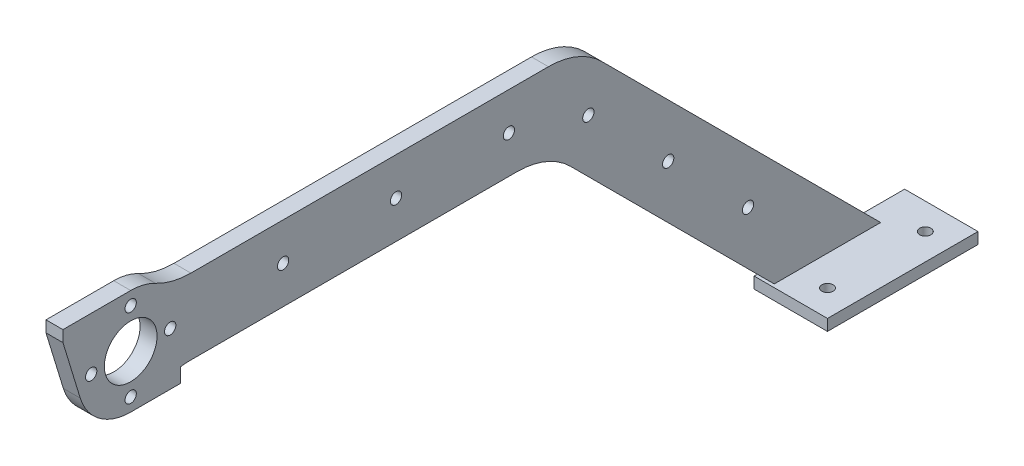
ISO-10303-21;
HEADER;
FILE_DESCRIPTION(('STEP AP214'),'2;1');
FILE_NAME('part.step','',(''),(''),'','','');
FILE_SCHEMA(('AUTOMOTIVE_DESIGN { 1 0 10303 214 1 1 1 1 }'));
ENDSEC;
DATA;
#1=APPLICATION_CONTEXT('core data for automotive mechanical design processes');
#2=APPLICATION_PROTOCOL_DEFINITION('international standard','automotive_design',2000,#1);
#3=PRODUCT_CONTEXT('',#1,'mechanical');
#4=PRODUCT('Part','Part','',(#3));
#5=PRODUCT_RELATED_PRODUCT_CATEGORY('part','',(#4));
#6=PRODUCT_DEFINITION_FORMATION('','',#4);
#7=PRODUCT_DEFINITION_CONTEXT('part definition',#1,'design');
#8=PRODUCT_DEFINITION('design','',#6,#7);
#9=PRODUCT_DEFINITION_SHAPE('','',#8);
#10=(LENGTH_UNIT() NAMED_UNIT(*) SI_UNIT(.MILLI.,.METRE.));
#11=(NAMED_UNIT(*) PLANE_ANGLE_UNIT() SI_UNIT($,.RADIAN.));
#12=(NAMED_UNIT(*) SI_UNIT($,.STERADIAN.) SOLID_ANGLE_UNIT());
#13=UNCERTAINTY_MEASURE_WITH_UNIT(LENGTH_MEASURE(1.E-05),#10,'distance_accuracy_value','');
#14=(GEOMETRIC_REPRESENTATION_CONTEXT(3) GLOBAL_UNCERTAINTY_ASSIGNED_CONTEXT((#13)) GLOBAL_UNIT_ASSIGNED_CONTEXT((#10,
#11,#12)) REPRESENTATION_CONTEXT('',''));
#15=CARTESIAN_POINT('',(0.,0.,0.));
#16=DIRECTION('',(0.,0.,1.));
#17=DIRECTION('',(1.,0.,0.));
#18=AXIS2_PLACEMENT_3D('',#15,#16,#17);
#19=CARTESIAN_POINT('',(2.25,-30.,-16.));
#20=DIRECTION('',(-1.,0.,0.));
#21=DIRECTION('',(0.,0.,1.));
#22=AXIS2_PLACEMENT_3D('',#19,#20,#21);
#23=CYLINDRICAL_SURFACE('',#22,20.);
#24=CARTESIAN_POINT('',(-2.25,-30.,-16.));
#25=DIRECTION('',(1.,0.,0.));
#26=DIRECTION('',(0.,0.,-1.));
#27=AXIS2_PLACEMENT_3D('',#24,#25,#26);
#28=CIRCLE('',#27,20.);
#29=CARTESIAN_POINT('',(-2.25,-10.,-16.));
#30=VERTEX_POINT('',#29);
#31=CARTESIAN_POINT('',(-2.25,-10.1935572336007,-13.2242433569657));
#32=VERTEX_POINT('',#31);
#33=EDGE_CURVE('E234',#30,#32,#28,.T.);
#34=ORIENTED_EDGE('',*,*,#33,.F.);
#35=DIRECTION('',(-1.,0.,0.));
#36=VECTOR('',#35,1.);
#37=CARTESIAN_POINT('',(2.25,-10.,-16.));
#38=LINE('',#37,#36);
#39=CARTESIAN_POINT('',(2.25,-10.,-16.));
#40=VERTEX_POINT('',#39);
#41=EDGE_CURVE('E11',#40,#30,#38,.T.);
#42=ORIENTED_EDGE('',*,*,#41,.F.);
#43=CARTESIAN_POINT('',(2.25,-30.,-16.));
#44=DIRECTION('',(1.,0.,0.));
#45=DIRECTION('',(0.,0.,-1.));
#46=AXIS2_PLACEMENT_3D('',#43,#44,#45);
#47=CIRCLE('',#46,20.);
#48=CARTESIAN_POINT('',(2.25,-10.1935572336007,-13.2242433569657));
#49=VERTEX_POINT('',#48);
#50=EDGE_CURVE('E322',#40,#49,#47,.T.);
#51=ORIENTED_EDGE('',*,*,#50,.T.);
#52=DIRECTION('',(-1.,0.,0.));
#53=VECTOR('',#52,1.);
#54=CARTESIAN_POINT('',(2.25,-10.1935572336007,-13.2242433569657));
#55=LINE('',#54,#53);
#56=EDGE_CURVE('E115',#49,#32,#55,.T.);
#57=ORIENTED_EDGE('',*,*,#56,.T.);
#58=EDGE_LOOP('',(#34,#42,#51,#57));
#59=FACE_BOUND('',#58,.T.);
#60=ADVANCED_FACE('F41',(#59),#23,.F.);
#61=CARTESIAN_POINT('',(2.25,-10.,0.));
#62=DIRECTION('',(0.,1.,0.));
#63=DIRECTION('',(0.,0.,1.));
#64=AXIS2_PLACEMENT_3D('',#61,#62,#63);
#65=PLANE('',#64);
#66=DIRECTION('',(0.,0.,-1.));
#67=VECTOR('',#66,1.);
#68=CARTESIAN_POINT('',(-2.25,-10.,0.));
#69=LINE('',#68,#67);
#70=CARTESIAN_POINT('',(-2.25,-10.,-102.736907966864));
#71=VERTEX_POINT('',#70);
#72=EDGE_CURVE('E238',#30,#71,#69,.T.);
#73=ORIENTED_EDGE('',*,*,#72,.T.);
#74=DIRECTION('',(-1.,0.,0.));
#75=VECTOR('',#74,1.);
#76=CARTESIAN_POINT('',(2.25,-10.,-102.736907966864));
#77=LINE('',#76,#75);
#78=CARTESIAN_POINT('',(2.25,-10.,-102.736907966864));
#79=VERTEX_POINT('',#78);
#80=EDGE_CURVE('E50',#79,#71,#77,.T.);
#81=ORIENTED_EDGE('',*,*,#80,.F.);
#82=DIRECTION('',(0.,0.,-1.));
#83=VECTOR('',#82,1.);
#84=CARTESIAN_POINT('',(2.25,-10.,0.));
#85=LINE('',#84,#83);
#86=EDGE_CURVE('E505',#40,#79,#85,.T.);
#87=ORIENTED_EDGE('',*,*,#86,.F.);
#88=ORIENTED_EDGE('',*,*,#41,.T.);
#89=EDGE_LOOP('',(#73,#81,#87,#88));
#90=FACE_BOUND('',#89,.T.);
#91=ADVANCED_FACE('F508',(#90),#65,.F.);
#92=CARTESIAN_POINT('',(2.25,-29.999988774128,-102.715717526666));
#93=DIRECTION('',(-1.,0.,0.));
#94=DIRECTION('',(0.,0.,1.));
#95=AXIS2_PLACEMENT_3D('',#92,#93,#94);
#96=CYLINDRICAL_SURFACE('',#95,20.);
#97=CARTESIAN_POINT('',(-2.25,-29.999988774128,-102.715717526666));
#98=DIRECTION('',(1.,0.,0.));
#99=DIRECTION('',(0.,0.,-1.));
#100=AXIS2_PLACEMENT_3D('',#97,#98,#99);
#101=CIRCLE('',#100,20.);
#102=CARTESIAN_POINT('',(-2.25,-15.857853150397,-116.857853150397));
#103=VERTEX_POINT('',#102);
#104=EDGE_CURVE('E242',#71,#103,#101,.F.);
#105=ORIENTED_EDGE('',*,*,#104,.T.);
#106=DIRECTION('',(-1.,0.,0.));
#107=VECTOR('',#106,1.);
#108=CARTESIAN_POINT('',(2.25,-15.857853150397,-116.857853150397));
#109=LINE('',#108,#107);
#110=CARTESIAN_POINT('',(2.25,-15.857853150397,-116.857853150397));
#111=VERTEX_POINT('',#110);
#112=EDGE_CURVE('E364',#111,#103,#109,.T.);
#113=ORIENTED_EDGE('',*,*,#112,.F.);
#114=CARTESIAN_POINT('',(2.25,-29.999988774128,-102.715717526666));
#115=DIRECTION('',(1.,0.,0.));
#116=DIRECTION('',(0.,0.,-1.));
#117=AXIS2_PLACEMENT_3D('',#114,#115,#116);
#118=CIRCLE('',#117,20.);
#119=EDGE_CURVE('E375',#79,#111,#118,.F.);
#120=ORIENTED_EDGE('',*,*,#119,.F.);
#121=ORIENTED_EDGE('',*,*,#80,.T.);
#122=EDGE_LOOP('',(#105,#113,#120,#121));
#123=FACE_BOUND('',#122,.T.);
#124=ADVANCED_FACE('F373',(#123),#96,.F.);
#125=CARTESIAN_POINT('',(2.25,50.5000000000001,-50.5000000000003));
#126=DIRECTION('',(0.,0.707106781186547,-0.707106781186548));
#127=DIRECTION('',(0.,0.707106781186548,0.707106781186547));
#128=AXIS2_PLACEMENT_3D('',#125,#126,#127);
#129=PLANE('',#128);
#130=DIRECTION('',(0.,-0.707106781186549,-0.707106781186547));
#131=VECTOR('',#130,1.);
#132=CARTESIAN_POINT('',(-2.25,50.5000000000001,-50.5000000000003));
#133=LINE('',#132,#131);
#134=CARTESIAN_POINT('',(-2.25,-70.,-171.));
#135=VERTEX_POINT('',#134);
#136=EDGE_CURVE('E245',#103,#135,#133,.T.);
#137=ORIENTED_EDGE('',*,*,#136,.T.);
#138=DIRECTION('',(-1.,0.,0.));
#139=VECTOR('',#138,1.);
#140=CARTESIAN_POINT('',(2.25,-70.,-171.));
#141=LINE('',#140,#139);
#142=CARTESIAN_POINT('',(2.25,-70.,-171.));
#143=VERTEX_POINT('',#142);
#144=EDGE_CURVE('E360',#143,#135,#141,.T.);
#145=ORIENTED_EDGE('',*,*,#144,.F.);
#146=DIRECTION('',(0.,-0.707106781186549,-0.707106781186547));
#147=VECTOR('',#146,1.);
#148=CARTESIAN_POINT('',(2.25,50.5000000000001,-50.5000000000003));
#149=LINE('',#148,#147);
#150=EDGE_CURVE('E402',#111,#143,#149,.T.);
#151=ORIENTED_EDGE('',*,*,#150,.F.);
#152=ORIENTED_EDGE('',*,*,#112,.T.);
#153=EDGE_LOOP('',(#137,#145,#151,#152));
#154=FACE_BOUND('',#153,.T.);
#155=ADVANCED_FACE('F388',(#154),#129,.F.);
#156=CARTESIAN_POINT('',(2.25,64.642135623731,-64.6421356237312));
#157=DIRECTION('',(0.,-0.707106781186546,0.707106781186548));
#158=DIRECTION('',(0.,-0.707106781186549,-0.707106781186546));
#159=AXIS2_PLACEMENT_3D('',#156,#157,#158);
#160=PLANE('',#159);
#161=DIRECTION('',(0.,0.707106781186549,0.707106781186546));
#162=VECTOR('',#161,1.);
#163=CARTESIAN_POINT('',(-2.25,64.642135623731,-64.6421356237312));
#164=LINE('',#163,#162);
#165=CARTESIAN_POINT('',(-2.25,-70.,-199.284271247462));
#166=VERTEX_POINT('',#165);
#167=CARTESIAN_POINT('',(-2.25,4.14213562373093,-125.142135623731));
#168=VERTEX_POINT('',#167);
#169=EDGE_CURVE('E249',#166,#168,#164,.T.);
#170=ORIENTED_EDGE('',*,*,#169,.T.);
#171=DIRECTION('',(-1.,0.,0.));
#172=VECTOR('',#171,1.);
#173=CARTESIAN_POINT('',(2.25,4.14213562373093,-125.142135623731));
#174=LINE('',#173,#172);
#175=CARTESIAN_POINT('',(2.25,4.14213562373093,-125.142135623731));
#176=VERTEX_POINT('',#175);
#177=EDGE_CURVE('E353',#176,#168,#174,.T.);
#178=ORIENTED_EDGE('',*,*,#177,.F.);
#179=DIRECTION('',(0.,0.707106781186549,0.707106781186546));
#180=VECTOR('',#179,1.);
#181=CARTESIAN_POINT('',(2.25,64.642135623731,-64.6421356237312));
#182=LINE('',#181,#180);
#183=CARTESIAN_POINT('',(2.25,-70.,-199.284271247462));
#184=VERTEX_POINT('',#183);
#185=EDGE_CURVE('E401',#184,#176,#182,.T.);
#186=ORIENTED_EDGE('',*,*,#185,.F.);
#187=DIRECTION('',(-1.,0.,0.));
#188=VECTOR('',#187,1.);
#189=CARTESIAN_POINT('',(2.25,-70.,-199.284271247462));
#190=LINE('',#189,#188);
#191=EDGE_CURVE('E357',#184,#166,#190,.T.);
#192=ORIENTED_EDGE('',*,*,#191,.T.);
#193=EDGE_LOOP('',(#170,#178,#186,#192));
#194=FACE_BOUND('',#193,.T.);
#195=ADVANCED_FACE('F518',(#194),#160,.F.);
#196=CARTESIAN_POINT('',(2.25,-10.,-111.));
#197=DIRECTION('',(-1.,0.,0.));
#198=DIRECTION('',(0.,0.,1.));
#199=AXIS2_PLACEMENT_3D('',#196,#197,#198);
#200=CYLINDRICAL_SURFACE('',#199,20.);
#201=CARTESIAN_POINT('',(-2.25,-10.,-111.));
#202=DIRECTION('',(1.,0.,0.));
#203=DIRECTION('',(0.,0.,-1.));
#204=AXIS2_PLACEMENT_3D('',#201,#202,#203);
#205=CIRCLE('',#204,20.);
#206=CARTESIAN_POINT('',(-2.25,10.,-111.));
#207=VERTEX_POINT('',#206);
#208=EDGE_CURVE('E252',#168,#207,#205,.T.);
#209=ORIENTED_EDGE('',*,*,#208,.T.);
#210=DIRECTION('',(-1.,0.,0.));
#211=VECTOR('',#210,1.);
#212=CARTESIAN_POINT('',(2.25,10.,-111.));
#213=LINE('',#212,#211);
#214=CARTESIAN_POINT('',(2.25,10.,-111.));
#215=VERTEX_POINT('',#214);
#216=EDGE_CURVE('E349',#215,#207,#213,.T.);
#217=ORIENTED_EDGE('',*,*,#216,.F.);
#218=CARTESIAN_POINT('',(2.25,-10.,-111.));
#219=DIRECTION('',(1.,0.,0.));
#220=DIRECTION('',(0.,0.,-1.));
#221=AXIS2_PLACEMENT_3D('',#218,#219,#220);
#222=CIRCLE('',#221,20.);
#223=EDGE_CURVE('E406',#176,#215,#222,.T.);
#224=ORIENTED_EDGE('',*,*,#223,.F.);
#225=ORIENTED_EDGE('',*,*,#177,.T.);
#226=EDGE_LOOP('',(#209,#217,#224,#225));
#227=FACE_BOUND('',#226,.T.);
#228=ADVANCED_FACE('F521',(#227),#200,.T.);
#229=CARTESIAN_POINT('',(2.25,10.,0.));
#230=DIRECTION('',(0.,-1.,0.));
#231=DIRECTION('',(0.,0.,-1.));
#232=AXIS2_PLACEMENT_3D('',#229,#230,#231);
#233=PLANE('',#232);
#234=DIRECTION('',(0.,0.,1.));
#235=VECTOR('',#234,1.);
#236=CARTESIAN_POINT('',(-2.25,10.,0.));
#237=LINE('',#236,#235);
#238=CARTESIAN_POINT('',(-2.25,10.,-16.));
#239=VERTEX_POINT('',#238);
#240=EDGE_CURVE('E255',#207,#239,#237,.T.);
#241=ORIENTED_EDGE('',*,*,#240,.T.);
#242=DIRECTION('',(-1.,0.,0.));
#243=VECTOR('',#242,1.);
#244=CARTESIAN_POINT('',(2.25,10.,-16.));
#245=LINE('',#244,#243);
#246=CARTESIAN_POINT('',(2.25,10.,-16.));
#247=VERTEX_POINT('',#246);
#248=EDGE_CURVE('E345',#247,#239,#245,.T.);
#249=ORIENTED_EDGE('',*,*,#248,.F.);
#250=DIRECTION('',(0.,0.,1.));
#251=VECTOR('',#250,1.);
#252=CARTESIAN_POINT('',(2.25,10.,0.));
#253=LINE('',#252,#251);
#254=EDGE_CURVE('E413',#215,#247,#253,.T.);
#255=ORIENTED_EDGE('',*,*,#254,.F.);
#256=ORIENTED_EDGE('',*,*,#216,.T.);
#257=EDGE_LOOP('',(#241,#249,#255,#256));
#258=FACE_BOUND('',#257,.T.);
#259=ADVANCED_FACE('F525',(#258),#233,.F.);
#260=CARTESIAN_POINT('',(2.25,30.,-16.));
#261=DIRECTION('',(-1.,0.,0.));
#262=DIRECTION('',(0.,0.,1.));
#263=AXIS2_PLACEMENT_3D('',#260,#261,#262);
#264=CYLINDRICAL_SURFACE('',#263,20.);
#265=CARTESIAN_POINT('',(-2.25,30.,-16.));
#266=DIRECTION('',(1.,0.,0.));
#267=DIRECTION('',(0.,0.,-1.));
#268=AXIS2_PLACEMENT_3D('',#265,#266,#267);
#269=CIRCLE('',#268,20.);
#270=CARTESIAN_POINT('',(-2.25,12.3529411764706,-6.58823529411764));
#271=VERTEX_POINT('',#270);
#272=EDGE_CURVE('E258',#239,#271,#269,.F.);
#273=ORIENTED_EDGE('',*,*,#272,.T.);
#274=DIRECTION('',(-1.,0.,0.));
#275=VECTOR('',#274,1.);
#276=CARTESIAN_POINT('',(2.25,12.3529411764706,-6.58823529411764));
#277=LINE('',#276,#275);
#278=CARTESIAN_POINT('',(2.25,12.3529411764706,-6.58823529411764));
#279=VERTEX_POINT('',#278);
#280=EDGE_CURVE('E341',#279,#271,#277,.T.);
#281=ORIENTED_EDGE('',*,*,#280,.F.);
#282=CARTESIAN_POINT('',(2.25,30.,-16.));
#283=DIRECTION('',(1.,0.,0.));
#284=DIRECTION('',(0.,0.,-1.));
#285=AXIS2_PLACEMENT_3D('',#282,#283,#284);
#286=CIRCLE('',#285,20.);
#287=EDGE_CURVE('E416',#247,#279,#286,.F.);
#288=ORIENTED_EDGE('',*,*,#287,.F.);
#289=ORIENTED_EDGE('',*,*,#248,.T.);
#290=EDGE_LOOP('',(#273,#281,#288,#289));
#291=FACE_BOUND('',#290,.T.);
#292=ADVANCED_FACE('F529',(#291),#264,.F.);
#293=CARTESIAN_POINT('',(2.25,0.,0.));
#294=DIRECTION('',(-1.,0.,0.));
#295=DIRECTION('',(0.,0.,1.));
#296=AXIS2_PLACEMENT_3D('',#293,#294,#295);
#297=CYLINDRICAL_SURFACE('',#296,14.);
#298=CARTESIAN_POINT('',(-2.25,0.,0.));
#299=DIRECTION('',(1.,0.,0.));
#300=DIRECTION('',(0.,0.,-1.));
#301=AXIS2_PLACEMENT_3D('',#298,#299,#300);
#302=CIRCLE('',#301,14.);
#303=CARTESIAN_POINT('',(-2.25,14.,0.));
#304=VERTEX_POINT('',#303);
#305=EDGE_CURVE('E261',#271,#304,#302,.T.);
#306=ORIENTED_EDGE('',*,*,#305,.T.);
#307=DIRECTION('',(-1.,0.,0.));
#308=VECTOR('',#307,1.);
#309=CARTESIAN_POINT('',(2.25,14.,0.));
#310=LINE('',#309,#308);
#311=CARTESIAN_POINT('',(2.25,14.,0.));
#312=VERTEX_POINT('',#311);
#313=EDGE_CURVE('E337',#312,#304,#310,.T.);
#314=ORIENTED_EDGE('',*,*,#313,.F.);
#315=CARTESIAN_POINT('',(2.25,0.,0.));
#316=DIRECTION('',(1.,0.,0.));
#317=DIRECTION('',(0.,0.,-1.));
#318=AXIS2_PLACEMENT_3D('',#315,#316,#317);
#319=CIRCLE('',#318,14.);
#320=EDGE_CURVE('E173',#279,#312,#319,.T.);
#321=ORIENTED_EDGE('',*,*,#320,.F.);
#322=ORIENTED_EDGE('',*,*,#280,.T.);
#323=EDGE_LOOP('',(#306,#314,#321,#322));
#324=FACE_BOUND('',#323,.T.);
#325=ADVANCED_FACE('F533',(#324),#297,.T.);
#326=CARTESIAN_POINT('',(2.25,14.,0.));
#327=DIRECTION('',(0.,-1.,0.));
#328=DIRECTION('',(0.,0.,-1.));
#329=AXIS2_PLACEMENT_3D('',#326,#327,#328);
#330=PLANE('',#329);
#331=DIRECTION('',(0.,0.,1.));
#332=VECTOR('',#331,1.);
#333=CARTESIAN_POINT('',(-2.25,14.,0.));
#334=LINE('',#333,#332);
#335=CARTESIAN_POINT('',(-2.25,14.,18.));
#336=VERTEX_POINT('',#335);
#337=EDGE_CURVE('E264',#304,#336,#334,.T.);
#338=ORIENTED_EDGE('',*,*,#337,.T.);
#339=DIRECTION('',(-1.,0.,0.));
#340=VECTOR('',#339,1.);
#341=CARTESIAN_POINT('',(2.25,14.,18.));
#342=LINE('',#341,#340);
#343=CARTESIAN_POINT('',(2.25,14.,18.));
#344=VERTEX_POINT('',#343);
#345=EDGE_CURVE('E333',#344,#336,#342,.T.);
#346=ORIENTED_EDGE('',*,*,#345,.F.);
#347=DIRECTION('',(0.,0.,1.));
#348=VECTOR('',#347,1.);
#349=CARTESIAN_POINT('',(2.25,14.,0.));
#350=LINE('',#349,#348);
#351=EDGE_CURVE('E420',#312,#344,#350,.T.);
#352=ORIENTED_EDGE('',*,*,#351,.F.);
#353=ORIENTED_EDGE('',*,*,#313,.T.);
#354=EDGE_LOOP('',(#338,#346,#352,#353));
#355=FACE_BOUND('',#354,.T.);
#356=ADVANCED_FACE('F535',(#355),#330,.F.);
#357=CARTESIAN_POINT('',(2.25,0.,18.));
#358=DIRECTION('',(0.,0.,-1.));
#359=DIRECTION('',(0.,1.,0.));
#360=AXIS2_PLACEMENT_3D('',#357,#358,#359);
#361=PLANE('',#360);
#362=DIRECTION('',(0.,-1.,0.));
#363=VECTOR('',#362,1.);
#364=CARTESIAN_POINT('',(-2.25,0.,18.));
#365=LINE('',#364,#363);
#366=CARTESIAN_POINT('',(-2.25,11.,18.));
#367=VERTEX_POINT('',#366);
#368=EDGE_CURVE('E267',#336,#367,#365,.T.);
#369=ORIENTED_EDGE('',*,*,#368,.T.);
#370=DIRECTION('',(-1.,0.,0.));
#371=VECTOR('',#370,1.);
#372=CARTESIAN_POINT('',(2.25,11.,18.));
#373=LINE('',#372,#371);
#374=CARTESIAN_POINT('',(2.25,11.,18.));
#375=VERTEX_POINT('',#374);
#376=EDGE_CURVE('E329',#375,#367,#373,.T.);
#377=ORIENTED_EDGE('',*,*,#376,.F.);
#378=DIRECTION('',(0.,-1.,0.));
#379=VECTOR('',#378,1.);
#380=CARTESIAN_POINT('',(2.25,0.,18.));
#381=LINE('',#380,#379);
#382=EDGE_CURVE('E422',#344,#375,#381,.T.);
#383=ORIENTED_EDGE('',*,*,#382,.F.);
#384=ORIENTED_EDGE('',*,*,#345,.T.);
#385=EDGE_LOOP('',(#369,#377,#383,#384));
#386=FACE_BOUND('',#385,.T.);
#387=ADVANCED_FACE('F430',(#386),#361,.F.);
#388=CARTESIAN_POINT('',(2.25,-4.09099534200223,13.3889415978903));
#389=DIRECTION('',(0.,0.292213953000159,-0.956352971277875));
#390=DIRECTION('',(0.,0.956352971277876,0.292213953000159));
#391=AXIS2_PLACEMENT_3D('',#388,#389,#390);
#392=PLANE('',#391);
#393=DIRECTION('',(0.,-0.956352971277876,-0.292213953000159));
#394=VECTOR('',#393,1.);
#395=CARTESIAN_POINT('',(-2.25,-4.09099534200223,13.3889415978903));
#396=LINE('',#395,#394);
#397=CARTESIAN_POINT('',(-2.25,-4.09099534200223,13.3889415978903));
#398=VERTEX_POINT('',#397);
#399=EDGE_CURVE('E270',#367,#398,#396,.T.);
#400=ORIENTED_EDGE('',*,*,#399,.T.);
#401=DIRECTION('',(-1.,0.,0.));
#402=VECTOR('',#401,1.);
#403=CARTESIAN_POINT('',(2.25,-4.09099534200223,13.3889415978903));
#404=LINE('',#403,#402);
#405=CARTESIAN_POINT('',(2.25,-4.09099534200223,13.3889415978903));
#406=VERTEX_POINT('',#405);
#407=EDGE_CURVE('E179',#406,#398,#404,.T.);
#408=ORIENTED_EDGE('',*,*,#407,.F.);
#409=DIRECTION('',(0.,-0.956352971277876,-0.292213953000159));
#410=VECTOR('',#409,1.);
#411=CARTESIAN_POINT('',(2.25,-4.09099534200223,13.3889415978903));
#412=LINE('',#411,#410);
#413=EDGE_CURVE('E167',#375,#406,#412,.T.);
#414=ORIENTED_EDGE('',*,*,#413,.F.);
#415=ORIENTED_EDGE('',*,*,#376,.T.);
#416=EDGE_LOOP('',(#400,#408,#414,#415));
#417=FACE_BOUND('',#416,.T.);
#418=ADVANCED_FACE('F434',(#417),#392,.F.);
#419=CARTESIAN_POINT('',(-2.25,-14.,-1.46642215033931E-13));
#420=VERTEX_POINT('',#419);
#421=EDGE_CURVE('E177',#398,#420,#302,.T.);
#422=ORIENTED_EDGE('',*,*,#421,.T.);
#423=DIRECTION('',(-1.,0.,0.));
#424=VECTOR('',#423,1.);
#425=CARTESIAN_POINT('',(2.25,-14.,-1.46642215033931E-13));
#426=LINE('',#425,#424);
#427=CARTESIAN_POINT('',(2.25,-14.,-1.46642215033931E-13));
#428=VERTEX_POINT('',#427);
#429=EDGE_CURVE('E174',#428,#420,#426,.T.);
#430=ORIENTED_EDGE('',*,*,#429,.F.);
#431=EDGE_CURVE('E160',#406,#428,#319,.T.);
#432=ORIENTED_EDGE('',*,*,#431,.F.);
#433=ORIENTED_EDGE('',*,*,#407,.T.);
#434=EDGE_LOOP('',(#422,#430,#432,#433));
#435=FACE_BOUND('',#434,.T.);
#436=ADVANCED_FACE('F175',(#435),#297,.T.);
#437=CARTESIAN_POINT('',(2.25,-14.,0.));
#438=DIRECTION('',(0.,1.,0.));
#439=DIRECTION('',(0.,0.,1.));
#440=AXIS2_PLACEMENT_3D('',#437,#438,#439);
#441=PLANE('',#440);
#442=DIRECTION('',(0.,0.,-1.));
#443=VECTOR('',#442,1.);
#444=CARTESIAN_POINT('',(-2.25,-14.,0.));
#445=LINE('',#444,#443);
#446=CARTESIAN_POINT('',(-2.25,-14.,-13.2242433569657));
#447=VERTEX_POINT('',#446);
#448=EDGE_CURVE('E108',#420,#447,#445,.T.);
#449=ORIENTED_EDGE('',*,*,#448,.T.);
#450=DIRECTION('',(-1.,0.,0.));
#451=VECTOR('',#450,1.);
#452=CARTESIAN_POINT('',(2.25,-14.,-13.2242433569657));
#453=LINE('',#452,#451);
#454=CARTESIAN_POINT('',(2.25,-14.,-13.2242433569657));
#455=VERTEX_POINT('',#454);
#456=EDGE_CURVE('E180',#455,#447,#453,.T.);
#457=ORIENTED_EDGE('',*,*,#456,.F.);
#458=DIRECTION('',(0.,0.,-1.));
#459=VECTOR('',#458,1.);
#460=CARTESIAN_POINT('',(2.25,-14.,0.));
#461=LINE('',#460,#459);
#462=EDGE_CURVE('E165',#428,#455,#461,.T.);
#463=ORIENTED_EDGE('',*,*,#462,.F.);
#464=ORIENTED_EDGE('',*,*,#429,.T.);
#465=EDGE_LOOP('',(#449,#457,#463,#464));
#466=FACE_BOUND('',#465,.T.);
#467=ADVANCED_FACE('F182',(#466),#441,.F.);
#468=CARTESIAN_POINT('',(2.25,10.5,0.));
#469=DIRECTION('',(-1.,0.,0.));
#470=DIRECTION('',(0.,0.,1.));
#471=AXIS2_PLACEMENT_3D('',#468,#469,#470);
#472=CYLINDRICAL_SURFACE('',#471,1.5);
#473=CARTESIAN_POINT('',(2.25,10.5,0.));
#474=DIRECTION('',(1.,0.,0.));
#475=DIRECTION('',(0.,0.,-1.));
#476=AXIS2_PLACEMENT_3D('',#473,#474,#475);
#477=CIRCLE('',#476,1.5);
#478=CARTESIAN_POINT('',(2.25,10.5,-1.5));
#479=VERTEX_POINT('',#478);
#480=EDGE_CURVE('E226',#479,#479,#477,.T.);
#481=ORIENTED_EDGE('',*,*,#480,.T.);
#482=EDGE_LOOP('',(#481));
#483=FACE_BOUND('',#482,.T.);
#484=CARTESIAN_POINT('',(-2.25,10.5,0.));
#485=DIRECTION('',(1.,0.,0.));
#486=DIRECTION('',(0.,0.,-1.));
#487=AXIS2_PLACEMENT_3D('',#484,#485,#486);
#488=CIRCLE('',#487,1.5);
#489=CARTESIAN_POINT('',(-2.25,10.5,-1.5));
#490=VERTEX_POINT('',#489);
#491=EDGE_CURVE('E314',#490,#490,#488,.T.);
#492=ORIENTED_EDGE('',*,*,#491,.F.);
#493=EDGE_LOOP('',(#492));
#494=FACE_BOUND('',#493,.T.);
#495=ADVANCED_FACE('F547',(#483,#494),#472,.F.);
#496=CARTESIAN_POINT('',(2.25,0.,-10.5));
#497=DIRECTION('',(-1.,0.,0.));
#498=DIRECTION('',(0.,0.,1.));
#499=AXIS2_PLACEMENT_3D('',#496,#497,#498);
#500=CYLINDRICAL_SURFACE('',#499,1.50000000000003);
#501=CARTESIAN_POINT('',(2.25,0.,-10.5));
#502=DIRECTION('',(1.,0.,0.));
#503=DIRECTION('',(0.,0.,-1.));
#504=AXIS2_PLACEMENT_3D('',#501,#502,#503);
#505=CIRCLE('',#504,1.50000000000003);
#506=CARTESIAN_POINT('',(2.25,0.,-12.));
#507=VERTEX_POINT('',#506);
#508=EDGE_CURVE('E222',#507,#507,#505,.T.);
#509=ORIENTED_EDGE('',*,*,#508,.T.);
#510=EDGE_LOOP('',(#509));
#511=FACE_BOUND('',#510,.T.);
#512=CARTESIAN_POINT('',(-2.25,0.,-10.5));
#513=DIRECTION('',(1.,0.,0.));
#514=DIRECTION('',(0.,0.,-1.));
#515=AXIS2_PLACEMENT_3D('',#512,#513,#514);
#516=CIRCLE('',#515,1.50000000000003);
#517=CARTESIAN_POINT('',(-2.25,0.,-12.));
#518=VERTEX_POINT('',#517);
#519=EDGE_CURVE('E310',#518,#518,#516,.T.);
#520=ORIENTED_EDGE('',*,*,#519,.F.);
#521=EDGE_LOOP('',(#520));
#522=FACE_BOUND('',#521,.T.);
#523=ADVANCED_FACE('F584',(#511,#522),#500,.F.);
#524=CARTESIAN_POINT('',(2.25,-10.5,0.));
#525=DIRECTION('',(-1.,0.,0.));
#526=DIRECTION('',(0.,0.,1.));
#527=AXIS2_PLACEMENT_3D('',#524,#525,#526);
#528=CYLINDRICAL_SURFACE('',#527,1.50000000000007);
#529=CARTESIAN_POINT('',(2.25,-10.5,0.));
#530=DIRECTION('',(1.,0.,0.));
#531=DIRECTION('',(0.,0.,-1.));
#532=AXIS2_PLACEMENT_3D('',#529,#530,#531);
#533=CIRCLE('',#532,1.50000000000007);
#534=CARTESIAN_POINT('',(2.25,-10.5,-1.50000000000007));
#535=VERTEX_POINT('',#534);
#536=EDGE_CURVE('E218',#535,#535,#533,.T.);
#537=ORIENTED_EDGE('',*,*,#536,.T.);
#538=EDGE_LOOP('',(#537));
#539=FACE_BOUND('',#538,.T.);
#540=CARTESIAN_POINT('',(-2.25,-10.5,0.));
#541=DIRECTION('',(1.,0.,0.));
#542=DIRECTION('',(0.,0.,-1.));
#543=AXIS2_PLACEMENT_3D('',#540,#541,#542);
#544=CIRCLE('',#543,1.50000000000007);
#545=CARTESIAN_POINT('',(-2.25,-10.5,-1.50000000000007));
#546=VERTEX_POINT('',#545);
#547=EDGE_CURVE('E306',#546,#546,#544,.T.);
#548=ORIENTED_EDGE('',*,*,#547,.F.);
#549=EDGE_LOOP('',(#548));
#550=FACE_BOUND('',#549,.T.);
#551=ADVANCED_FACE('F580',(#539,#550),#528,.F.);
#552=CARTESIAN_POINT('',(2.25,0.,10.5));
#553=DIRECTION('',(-1.,0.,0.));
#554=DIRECTION('',(0.,0.,1.));
#555=AXIS2_PLACEMENT_3D('',#552,#553,#554);
#556=CYLINDRICAL_SURFACE('',#555,1.5000000000001);
#557=CARTESIAN_POINT('',(2.25,0.,10.5));
#558=DIRECTION('',(1.,0.,0.));
#559=DIRECTION('',(0.,0.,-1.));
#560=AXIS2_PLACEMENT_3D('',#557,#558,#559);
#561=CIRCLE('',#560,1.5000000000001);
#562=CARTESIAN_POINT('',(2.25,0.,8.9999999999999));
#563=VERTEX_POINT('',#562);
#564=EDGE_CURVE('E214',#563,#563,#561,.T.);
#565=ORIENTED_EDGE('',*,*,#564,.T.);
#566=EDGE_LOOP('',(#565));
#567=FACE_BOUND('',#566,.T.);
#568=CARTESIAN_POINT('',(-2.25,0.,10.5));
#569=DIRECTION('',(1.,0.,0.));
#570=DIRECTION('',(0.,0.,-1.));
#571=AXIS2_PLACEMENT_3D('',#568,#569,#570);
#572=CIRCLE('',#571,1.5000000000001);
#573=CARTESIAN_POINT('',(-2.25,0.,8.9999999999999));
#574=VERTEX_POINT('',#573);
#575=EDGE_CURVE('E302',#574,#574,#572,.T.);
#576=ORIENTED_EDGE('',*,*,#575,.F.);
#577=EDGE_LOOP('',(#576));
#578=FACE_BOUND('',#577,.T.);
#579=ADVANCED_FACE('F576',(#567,#578),#556,.F.);
#580=CARTESIAN_POINT('',(2.25,0.,-40.5));
#581=DIRECTION('',(-1.,0.,0.));
#582=DIRECTION('',(0.,0.,1.));
#583=AXIS2_PLACEMENT_3D('',#580,#581,#582);
#584=CYLINDRICAL_SURFACE('',#583,1.5);
#585=CARTESIAN_POINT('',(2.25,0.,-40.5));
#586=DIRECTION('',(1.,0.,0.));
#587=DIRECTION('',(0.,0.,-1.));
#588=AXIS2_PLACEMENT_3D('',#585,#586,#587);
#589=CIRCLE('',#588,1.5);
#590=CARTESIAN_POINT('',(2.25,0.,-42.));
#591=VERTEX_POINT('',#590);
#592=EDGE_CURVE('E210',#591,#591,#589,.T.);
#593=ORIENTED_EDGE('',*,*,#592,.T.);
#594=EDGE_LOOP('',(#593));
#595=FACE_BOUND('',#594,.T.);
#596=CARTESIAN_POINT('',(-2.25,0.,-40.5));
#597=DIRECTION('',(1.,0.,0.));
#598=DIRECTION('',(0.,0.,-1.));
#599=AXIS2_PLACEMENT_3D('',#596,#597,#598);
#600=CIRCLE('',#599,1.5);
#601=CARTESIAN_POINT('',(-2.25,0.,-42.));
#602=VERTEX_POINT('',#601);
#603=EDGE_CURVE('E298',#602,#602,#600,.T.);
#604=ORIENTED_EDGE('',*,*,#603,.F.);
#605=EDGE_LOOP('',(#604));
#606=FACE_BOUND('',#605,.T.);
#607=ADVANCED_FACE('F572',(#595,#606),#584,.F.);
#608=CARTESIAN_POINT('',(2.25,0.,-70.5));
#609=DIRECTION('',(-1.,0.,0.));
#610=DIRECTION('',(0.,0.,1.));
#611=AXIS2_PLACEMENT_3D('',#608,#609,#610);
#612=CYLINDRICAL_SURFACE('',#611,1.5);
#613=CARTESIAN_POINT('',(2.25,0.,-70.5));
#614=DIRECTION('',(1.,0.,0.));
#615=DIRECTION('',(0.,0.,-1.));
#616=AXIS2_PLACEMENT_3D('',#613,#614,#615);
#617=CIRCLE('',#616,1.5);
#618=CARTESIAN_POINT('',(2.25,0.,-72.));
#619=VERTEX_POINT('',#618);
#620=EDGE_CURVE('E206',#619,#619,#617,.T.);
#621=ORIENTED_EDGE('',*,*,#620,.T.);
#622=EDGE_LOOP('',(#621));
#623=FACE_BOUND('',#622,.T.);
#624=CARTESIAN_POINT('',(-2.25,0.,-70.5));
#625=DIRECTION('',(1.,0.,0.));
#626=DIRECTION('',(0.,0.,-1.));
#627=AXIS2_PLACEMENT_3D('',#624,#625,#626);
#628=CIRCLE('',#627,1.5);
#629=CARTESIAN_POINT('',(-2.25,0.,-72.));
#630=VERTEX_POINT('',#629);
#631=EDGE_CURVE('E294',#630,#630,#628,.T.);
#632=ORIENTED_EDGE('',*,*,#631,.F.);
#633=EDGE_LOOP('',(#632));
#634=FACE_BOUND('',#633,.T.);
#635=ADVANCED_FACE('F568',(#623,#634),#612,.F.);
#636=CARTESIAN_POINT('',(2.25,0.,-100.5));
#637=DIRECTION('',(-1.,0.,0.));
#638=DIRECTION('',(0.,0.,1.));
#639=AXIS2_PLACEMENT_3D('',#636,#637,#638);
#640=CYLINDRICAL_SURFACE('',#639,1.5);
#641=CARTESIAN_POINT('',(2.25,0.,-100.5));
#642=DIRECTION('',(1.,0.,0.));
#643=DIRECTION('',(0.,0.,-1.));
#644=AXIS2_PLACEMENT_3D('',#641,#642,#643);
#645=CIRCLE('',#644,1.5);
#646=CARTESIAN_POINT('',(2.25,0.,-102.));
#647=VERTEX_POINT('',#646);
#648=EDGE_CURVE('E202',#647,#647,#645,.T.);
#649=ORIENTED_EDGE('',*,*,#648,.T.);
#650=EDGE_LOOP('',(#649));
#651=FACE_BOUND('',#650,.T.);
#652=CARTESIAN_POINT('',(-2.25,0.,-100.5));
#653=DIRECTION('',(1.,0.,0.));
#654=DIRECTION('',(0.,0.,-1.));
#655=AXIS2_PLACEMENT_3D('',#652,#653,#654);
#656=CIRCLE('',#655,1.5);
#657=CARTESIAN_POINT('',(-2.25,0.,-102.));
#658=VERTEX_POINT('',#657);
#659=EDGE_CURVE('E290',#658,#658,#656,.T.);
#660=ORIENTED_EDGE('',*,*,#659,.F.);
#661=EDGE_LOOP('',(#660));
#662=FACE_BOUND('',#661,.T.);
#663=ADVANCED_FACE('F564',(#651,#662),#640,.F.);
#664=CARTESIAN_POINT('',(2.25,-6.46786437626887,-121.61));
#665=DIRECTION('',(-1.,0.,0.));
#666=DIRECTION('',(0.,0.,1.));
#667=AXIS2_PLACEMENT_3D('',#664,#665,#666);
#668=CYLINDRICAL_SURFACE('',#667,1.49999999999995);
#669=CARTESIAN_POINT('',(2.25,-6.46786437626887,-121.61));
#670=DIRECTION('',(1.,0.,0.));
#671=DIRECTION('',(0.,0.,-1.));
#672=AXIS2_PLACEMENT_3D('',#669,#670,#671);
#673=CIRCLE('',#672,1.49999999999995);
#674=CARTESIAN_POINT('',(2.25,-6.46786437626887,-123.11));
#675=VERTEX_POINT('',#674);
#676=EDGE_CURVE('E198',#675,#675,#673,.T.);
#677=ORIENTED_EDGE('',*,*,#676,.T.);
#678=EDGE_LOOP('',(#677));
#679=FACE_BOUND('',#678,.T.);
#680=CARTESIAN_POINT('',(-2.25,-6.46786437626887,-121.61));
#681=DIRECTION('',(1.,0.,0.));
#682=DIRECTION('',(0.,0.,-1.));
#683=AXIS2_PLACEMENT_3D('',#680,#681,#682);
#684=CIRCLE('',#683,1.49999999999995);
#685=CARTESIAN_POINT('',(-2.25,-6.46786437626887,-123.11));
#686=VERTEX_POINT('',#685);
#687=EDGE_CURVE('E286',#686,#686,#684,.T.);
#688=ORIENTED_EDGE('',*,*,#687,.F.);
#689=EDGE_LOOP('',(#688));
#690=FACE_BOUND('',#689,.T.);
#691=ADVANCED_FACE('F560',(#679,#690),#668,.F.);
#692=CARTESIAN_POINT('',(2.25,-27.6810678118653,-142.823203435596));
#693=DIRECTION('',(-1.,0.,0.));
#694=DIRECTION('',(0.,0.,1.));
#695=AXIS2_PLACEMENT_3D('',#692,#693,#694);
#696=CYLINDRICAL_SURFACE('',#695,1.49999999999995);
#697=CARTESIAN_POINT('',(2.25,-27.6810678118653,-142.823203435596));
#698=DIRECTION('',(1.,0.,0.));
#699=DIRECTION('',(0.,0.,-1.));
#700=AXIS2_PLACEMENT_3D('',#697,#698,#699);
#701=CIRCLE('',#700,1.49999999999995);
#702=CARTESIAN_POINT('',(2.25,-27.6810678118653,-144.323203435596));
#703=VERTEX_POINT('',#702);
#704=EDGE_CURVE('E194',#703,#703,#701,.T.);
#705=ORIENTED_EDGE('',*,*,#704,.T.);
#706=EDGE_LOOP('',(#705));
#707=FACE_BOUND('',#706,.T.);
#708=CARTESIAN_POINT('',(-2.25,-27.6810678118653,-142.823203435596));
#709=DIRECTION('',(1.,0.,0.));
#710=DIRECTION('',(0.,0.,-1.));
#711=AXIS2_PLACEMENT_3D('',#708,#709,#710);
#712=CIRCLE('',#711,1.49999999999995);
#713=CARTESIAN_POINT('',(-2.25,-27.6810678118653,-144.323203435596));
#714=VERTEX_POINT('',#713);
#715=EDGE_CURVE('E282',#714,#714,#712,.T.);
#716=ORIENTED_EDGE('',*,*,#715,.F.);
#717=EDGE_LOOP('',(#716));
#718=FACE_BOUND('',#717,.T.);
#719=ADVANCED_FACE('F556',(#707,#718),#696,.F.);
#720=CARTESIAN_POINT('',(2.25,-48.8942712474618,-164.036406871193));
#721=DIRECTION('',(-1.,0.,0.));
#722=DIRECTION('',(0.,0.,1.));
#723=AXIS2_PLACEMENT_3D('',#720,#721,#722);
#724=CYLINDRICAL_SURFACE('',#723,1.50000000000001);
#725=CARTESIAN_POINT('',(2.25,-48.8942712474618,-164.036406871193));
#726=DIRECTION('',(1.,0.,0.));
#727=DIRECTION('',(0.,0.,-1.));
#728=AXIS2_PLACEMENT_3D('',#725,#726,#727);
#729=CIRCLE('',#728,1.50000000000001);
#730=CARTESIAN_POINT('',(2.25,-48.8942712474618,-165.536406871193));
#731=VERTEX_POINT('',#730);
#732=EDGE_CURVE('E186',#731,#731,#729,.T.);
#733=ORIENTED_EDGE('',*,*,#732,.T.);
#734=EDGE_LOOP('',(#733));
#735=FACE_BOUND('',#734,.T.);
#736=CARTESIAN_POINT('',(-2.25,-48.8942712474618,-164.036406871193));
#737=DIRECTION('',(1.,0.,0.));
#738=DIRECTION('',(0.,0.,-1.));
#739=AXIS2_PLACEMENT_3D('',#736,#737,#738);
#740=CIRCLE('',#739,1.50000000000001);
#741=CARTESIAN_POINT('',(-2.25,-48.8942712474618,-165.536406871193));
#742=VERTEX_POINT('',#741);
#743=EDGE_CURVE('E278',#742,#742,#740,.T.);
#744=ORIENTED_EDGE('',*,*,#743,.F.);
#745=EDGE_LOOP('',(#744));
#746=FACE_BOUND('',#745,.T.);
#747=ADVANCED_FACE('F552',(#735,#746),#724,.F.);
#748=CARTESIAN_POINT('',(2.25,0.,-13.2242433569657));
#749=DIRECTION('',(0.,0.,1.));
#750=DIRECTION('',(1.,0.,0.));
#751=AXIS2_PLACEMENT_3D('',#748,#749,#750);
#752=PLANE('',#751);
#753=DIRECTION('',(0.,1.,0.));
#754=VECTOR('',#753,1.);
#755=CARTESIAN_POINT('',(-2.25,0.,-13.2242433569657));
#756=LINE('',#755,#754);
#757=EDGE_CURVE('E275',#447,#32,#756,.T.);
#758=ORIENTED_EDGE('',*,*,#757,.T.);
#759=ORIENTED_EDGE('',*,*,#56,.F.);
#760=DIRECTION('',(0.,1.,0.));
#761=VECTOR('',#760,1.);
#762=CARTESIAN_POINT('',(2.25,0.,-13.2242433569657));
#763=LINE('',#762,#761);
#764=EDGE_CURVE('E58',#455,#49,#763,.T.);
#765=ORIENTED_EDGE('',*,*,#764,.F.);
#766=ORIENTED_EDGE('',*,*,#456,.T.);
#767=EDGE_LOOP('',(#758,#759,#765,#766));
#768=FACE_BOUND('',#767,.T.);
#769=ADVANCED_FACE('F548',(#768),#752,.F.);
#770=CARTESIAN_POINT('',(2.25,0.,0.));
#771=DIRECTION('',(-1.,0.,0.));
#772=DIRECTION('',(0.,0.,1.));
#773=AXIS2_PLACEMENT_3D('',#770,#771,#772);
#774=CYLINDRICAL_SURFACE('',#773,7.);
#775=CARTESIAN_POINT('',(2.25,0.,0.));
#776=DIRECTION('',(1.,0.,0.));
#777=DIRECTION('',(0.,0.,-1.));
#778=AXIS2_PLACEMENT_3D('',#775,#776,#777);
#779=CIRCLE('',#778,7.);
#780=CARTESIAN_POINT('',(2.25,0.,-7.));
#781=VERTEX_POINT('',#780);
#782=EDGE_CURVE('E230',#781,#781,#779,.T.);
#783=ORIENTED_EDGE('',*,*,#782,.T.);
#784=EDGE_LOOP('',(#783));
#785=FACE_BOUND('',#784,.T.);
#786=CARTESIAN_POINT('',(-2.25,0.,0.));
#787=DIRECTION('',(1.,0.,0.));
#788=DIRECTION('',(0.,0.,-1.));
#789=AXIS2_PLACEMENT_3D('',#786,#787,#788);
#790=CIRCLE('',#789,7.);
#791=CARTESIAN_POINT('',(-2.25,0.,-7.));
#792=VERTEX_POINT('',#791);
#793=EDGE_CURVE('E318',#792,#792,#790,.T.);
#794=ORIENTED_EDGE('',*,*,#793,.F.);
#795=EDGE_LOOP('',(#794));
#796=FACE_BOUND('',#795,.T.);
#797=ADVANCED_FACE('F551',(#785,#796),#774,.F.);
#798=CARTESIAN_POINT('',(2.25,0.,0.));
#799=DIRECTION('',(1.,0.,0.));
#800=DIRECTION('',(0.,0.,-1.));
#801=AXIS2_PLACEMENT_3D('',#798,#799,#800);
#802=PLANE('',#801);
#803=ORIENTED_EDGE('',*,*,#50,.F.);
#804=ORIENTED_EDGE('',*,*,#86,.T.);
#805=ORIENTED_EDGE('',*,*,#119,.T.);
#806=ORIENTED_EDGE('',*,*,#150,.T.);
#807=DIRECTION('',(0.,0.,-1.));
#808=VECTOR('',#807,1.);
#809=CARTESIAN_POINT('',(2.25,-70.,0.));
#810=LINE('',#809,#808);
#811=EDGE_CURVE('E397',#143,#184,#810,.T.);
#812=ORIENTED_EDGE('',*,*,#811,.T.);
#813=ORIENTED_EDGE('',*,*,#185,.T.);
#814=ORIENTED_EDGE('',*,*,#223,.T.);
#815=ORIENTED_EDGE('',*,*,#254,.T.);
#816=ORIENTED_EDGE('',*,*,#287,.T.);
#817=ORIENTED_EDGE('',*,*,#320,.T.);
#818=ORIENTED_EDGE('',*,*,#351,.T.);
#819=ORIENTED_EDGE('',*,*,#382,.T.);
#820=ORIENTED_EDGE('',*,*,#413,.T.);
#821=ORIENTED_EDGE('',*,*,#431,.T.);
#822=ORIENTED_EDGE('',*,*,#462,.T.);
#823=ORIENTED_EDGE('',*,*,#764,.T.);
#824=EDGE_LOOP('',(#803,#804,#805,#806,#812,#813,#814,#815,#816,#817,#818,#819,#820,#821,#822,#823));
#825=FACE_BOUND('',#824,.T.);
#826=ORIENTED_EDGE('',*,*,#732,.F.);
#827=EDGE_LOOP('',(#826));
#828=FACE_BOUND('',#827,.T.);
#829=ORIENTED_EDGE('',*,*,#704,.F.);
#830=EDGE_LOOP('',(#829));
#831=FACE_BOUND('',#830,.T.);
#832=ORIENTED_EDGE('',*,*,#676,.F.);
#833=EDGE_LOOP('',(#832));
#834=FACE_BOUND('',#833,.T.);
#835=ORIENTED_EDGE('',*,*,#648,.F.);
#836=EDGE_LOOP('',(#835));
#837=FACE_BOUND('',#836,.T.);
#838=ORIENTED_EDGE('',*,*,#620,.F.);
#839=EDGE_LOOP('',(#838));
#840=FACE_BOUND('',#839,.T.);
#841=ORIENTED_EDGE('',*,*,#592,.F.);
#842=EDGE_LOOP('',(#841));
#843=FACE_BOUND('',#842,.T.);
#844=ORIENTED_EDGE('',*,*,#564,.F.);
#845=EDGE_LOOP('',(#844));
#846=FACE_BOUND('',#845,.T.);
#847=ORIENTED_EDGE('',*,*,#536,.F.);
#848=EDGE_LOOP('',(#847));
#849=FACE_BOUND('',#848,.T.);
#850=ORIENTED_EDGE('',*,*,#508,.F.);
#851=EDGE_LOOP('',(#850));
#852=FACE_BOUND('',#851,.T.);
#853=ORIENTED_EDGE('',*,*,#480,.F.);
#854=EDGE_LOOP('',(#853));
#855=FACE_BOUND('',#854,.T.);
#856=ORIENTED_EDGE('',*,*,#782,.F.);
#857=EDGE_LOOP('',(#856));
#858=FACE_BOUND('',#857,.T.);
#859=ADVANCED_FACE('F162',(#825,#828,#831,#834,#837,#840,#843,#846,#849,#852,#855,#858),#802,.T.);
#860=CARTESIAN_POINT('',(-2.25,0.,0.));
#861=DIRECTION('',(1.,0.,0.));
#862=DIRECTION('',(0.,0.,-1.));
#863=AXIS2_PLACEMENT_3D('',#860,#861,#862);
#864=PLANE('',#863);
#865=ORIENTED_EDGE('',*,*,#33,.T.);
#866=ORIENTED_EDGE('',*,*,#757,.F.);
#867=ORIENTED_EDGE('',*,*,#448,.F.);
#868=ORIENTED_EDGE('',*,*,#421,.F.);
#869=ORIENTED_EDGE('',*,*,#399,.F.);
#870=ORIENTED_EDGE('',*,*,#368,.F.);
#871=ORIENTED_EDGE('',*,*,#337,.F.);
#872=ORIENTED_EDGE('',*,*,#305,.F.);
#873=ORIENTED_EDGE('',*,*,#272,.F.);
#874=ORIENTED_EDGE('',*,*,#240,.F.);
#875=ORIENTED_EDGE('',*,*,#208,.F.);
#876=ORIENTED_EDGE('',*,*,#169,.F.);
#877=DIRECTION('',(0.,0.,-1.));
#878=VECTOR('',#877,1.);
#879=CARTESIAN_POINT('',(-2.25,-70.,-170.144271247462));
#880=LINE('',#879,#878);
#881=CARTESIAN_POINT('',(-2.25,-70.,-210.144271247462));
#882=VERTEX_POINT('',#881);
#883=EDGE_CURVE('E481',#166,#882,#880,.T.);
#884=ORIENTED_EDGE('',*,*,#883,.T.);
#885=DIRECTION('',(0.,1.,0.));
#886=VECTOR('',#885,1.);
#887=CARTESIAN_POINT('',(-2.25,-73.,-210.144271247462));
#888=LINE('',#887,#886);
#889=CARTESIAN_POINT('',(-2.25,-73.,-210.144271247462));
#890=VERTEX_POINT('',#889);
#891=EDGE_CURVE('E239',#890,#882,#888,.T.);
#892=ORIENTED_EDGE('',*,*,#891,.F.);
#893=DIRECTION('',(0.,0.,-1.));
#894=VECTOR('',#893,1.);
#895=CARTESIAN_POINT('',(-2.25,-73.,-170.144271247462));
#896=LINE('',#895,#894);
#897=CARTESIAN_POINT('',(-2.25,-73.,-170.144271247462));
#898=VERTEX_POINT('',#897);
#899=EDGE_CURVE('E463',#898,#890,#896,.T.);
#900=ORIENTED_EDGE('',*,*,#899,.F.);
#901=DIRECTION('',(0.,1.,0.));
#902=VECTOR('',#901,1.);
#903=CARTESIAN_POINT('',(-2.25,-73.,-170.144271247462));
#904=LINE('',#903,#902);
#905=CARTESIAN_POINT('',(-2.25,-70.,-170.144271247462));
#906=VERTEX_POINT('',#905);
#907=EDGE_CURVE('E448',#898,#906,#904,.T.);
#908=ORIENTED_EDGE('',*,*,#907,.T.);
#909=EDGE_CURVE('E385',#906,#135,#880,.T.);
#910=ORIENTED_EDGE('',*,*,#909,.T.);
#911=ORIENTED_EDGE('',*,*,#136,.F.);
#912=ORIENTED_EDGE('',*,*,#104,.F.);
#913=ORIENTED_EDGE('',*,*,#72,.F.);
#914=EDGE_LOOP('',(#865,#866,#867,#868,#869,#870,#871,#872,#873,#874,#875,#876,#884,#892,#900,
#908,#910,#911,#912,#913));
#915=FACE_BOUND('',#914,.T.);
#916=ORIENTED_EDGE('',*,*,#743,.T.);
#917=EDGE_LOOP('',(#916));
#918=FACE_BOUND('',#917,.T.);
#919=ORIENTED_EDGE('',*,*,#715,.T.);
#920=EDGE_LOOP('',(#919));
#921=FACE_BOUND('',#920,.T.);
#922=ORIENTED_EDGE('',*,*,#687,.T.);
#923=EDGE_LOOP('',(#922));
#924=FACE_BOUND('',#923,.T.);
#925=ORIENTED_EDGE('',*,*,#659,.T.);
#926=EDGE_LOOP('',(#925));
#927=FACE_BOUND('',#926,.T.);
#928=ORIENTED_EDGE('',*,*,#631,.T.);
#929=EDGE_LOOP('',(#928));
#930=FACE_BOUND('',#929,.T.);
#931=ORIENTED_EDGE('',*,*,#603,.T.);
#932=EDGE_LOOP('',(#931));
#933=FACE_BOUND('',#932,.T.);
#934=ORIENTED_EDGE('',*,*,#575,.T.);
#935=EDGE_LOOP('',(#934));
#936=FACE_BOUND('',#935,.T.);
#937=ORIENTED_EDGE('',*,*,#547,.T.);
#938=EDGE_LOOP('',(#937));
#939=FACE_BOUND('',#938,.T.);
#940=ORIENTED_EDGE('',*,*,#519,.T.);
#941=EDGE_LOOP('',(#940));
#942=FACE_BOUND('',#941,.T.);
#943=ORIENTED_EDGE('',*,*,#491,.T.);
#944=EDGE_LOOP('',(#943));
#945=FACE_BOUND('',#944,.T.);
#946=ORIENTED_EDGE('',*,*,#793,.T.);
#947=EDGE_LOOP('',(#946));
#948=FACE_BOUND('',#947,.T.);
#949=ADVANCED_FACE('F380',(#915,#918,#921,#924,#927,#930,#933,#936,#939,#942,#945,#948),#864,.F.);
#950=CARTESIAN_POINT('',(-2.25,-73.,-210.144271247462));
#951=DIRECTION('',(0.,0.,1.));
#952=DIRECTION('',(1.,0.,0.));
#953=AXIS2_PLACEMENT_3D('',#950,#951,#952);
#954=PLANE('',#953);
#955=DIRECTION('',(1.,0.,0.));
#956=VECTOR('',#955,1.);
#957=CARTESIAN_POINT('',(-2.25,-70.,-210.144271247462));
#958=LINE('',#957,#956);
#959=CARTESIAN_POINT('',(17.25,-70.,-210.144271247462));
#960=VERTEX_POINT('',#959);
#961=EDGE_CURVE('E475',#882,#960,#958,.T.);
#962=ORIENTED_EDGE('',*,*,#961,.T.);
#963=DIRECTION('',(0.,1.,0.));
#964=VECTOR('',#963,1.);
#965=CARTESIAN_POINT('',(17.25,-73.,-210.144271247462));
#966=LINE('',#965,#964);
#967=CARTESIAN_POINT('',(17.25,-73.,-210.144271247462));
#968=VERTEX_POINT('',#967);
#969=EDGE_CURVE('E440',#968,#960,#966,.T.);
#970=ORIENTED_EDGE('',*,*,#969,.F.);
#971=DIRECTION('',(1.,0.,0.));
#972=VECTOR('',#971,1.);
#973=CARTESIAN_POINT('',(-2.25,-73.,-210.144271247462));
#974=LINE('',#973,#972);
#975=EDGE_CURVE('E459',#890,#968,#974,.T.);
#976=ORIENTED_EDGE('',*,*,#975,.F.);
#977=ORIENTED_EDGE('',*,*,#891,.T.);
#978=EDGE_LOOP('',(#962,#970,#976,#977));
#979=FACE_BOUND('',#978,.T.);
#980=ADVANCED_FACE('F597',(#979),#954,.F.);
#981=CARTESIAN_POINT('',(17.25,-73.,-170.144271247462));
#982=DIRECTION('',(-1.,0.,0.));
#983=DIRECTION('',(0.,0.,1.));
#984=AXIS2_PLACEMENT_3D('',#981,#982,#983);
#985=PLANE('',#984);
#986=DIRECTION('',(0.,0.,1.));
#987=VECTOR('',#986,1.);
#988=CARTESIAN_POINT('',(17.25,-70.,-170.144271247462));
#989=LINE('',#988,#987);
#990=CARTESIAN_POINT('',(17.25,-70.,-170.144271247462));
#991=VERTEX_POINT('',#990);
#992=EDGE_CURVE('E471',#960,#991,#989,.T.);
#993=ORIENTED_EDGE('',*,*,#992,.T.);
#994=DIRECTION('',(0.,1.,0.));
#995=VECTOR('',#994,1.);
#996=CARTESIAN_POINT('',(17.25,-73.,-170.144271247462));
#997=LINE('',#996,#995);
#998=CARTESIAN_POINT('',(17.25,-73.,-170.144271247462));
#999=VERTEX_POINT('',#998);
#1000=EDGE_CURVE('E444',#999,#991,#997,.T.);
#1001=ORIENTED_EDGE('',*,*,#1000,.F.);
#1002=DIRECTION('',(0.,0.,1.));
#1003=VECTOR('',#1002,1.);
#1004=CARTESIAN_POINT('',(17.25,-73.,-170.144271247462));
#1005=LINE('',#1004,#1003);
#1006=EDGE_CURVE('E455',#968,#999,#1005,.T.);
#1007=ORIENTED_EDGE('',*,*,#1006,.F.);
#1008=ORIENTED_EDGE('',*,*,#969,.T.);
#1009=EDGE_LOOP('',(#993,#1001,#1007,#1008));
#1010=FACE_BOUND('',#1009,.T.);
#1011=ADVANCED_FACE('F602',(#1010),#985,.F.);
#1012=CARTESIAN_POINT('',(-2.25,-73.,-170.144271247462));
#1013=DIRECTION('',(0.,0.,-1.));
#1014=DIRECTION('',(-1.,0.,0.));
#1015=AXIS2_PLACEMENT_3D('',#1012,#1013,#1014);
#1016=PLANE('',#1015);
#1017=DIRECTION('',(-1.,0.,0.));
#1018=VECTOR('',#1017,1.);
#1019=CARTESIAN_POINT('',(-2.25,-70.,-170.144271247462));
#1020=LINE('',#1019,#1018);
#1021=EDGE_CURVE('E467',#991,#906,#1020,.T.);
#1022=ORIENTED_EDGE('',*,*,#1021,.T.);
#1023=ORIENTED_EDGE('',*,*,#907,.F.);
#1024=DIRECTION('',(-1.,0.,0.));
#1025=VECTOR('',#1024,1.);
#1026=CARTESIAN_POINT('',(-2.25,-73.,-170.144271247462));
#1027=LINE('',#1026,#1025);
#1028=EDGE_CURVE('E451',#999,#898,#1027,.T.);
#1029=ORIENTED_EDGE('',*,*,#1028,.F.);
#1030=ORIENTED_EDGE('',*,*,#1000,.T.);
#1031=EDGE_LOOP('',(#1022,#1023,#1029,#1030));
#1032=FACE_BOUND('',#1031,.T.);
#1033=ADVANCED_FACE('F606',(#1032),#1016,.F.);
#1034=CARTESIAN_POINT('',(0.,-73.,0.));
#1035=DIRECTION('',(0.,-1.,0.));
#1036=DIRECTION('',(0.,0.,-1.));
#1037=AXIS2_PLACEMENT_3D('',#1034,#1035,#1036);
#1038=PLANE('',#1037);
#1039=CARTESIAN_POINT('',(10.25,-73.,-203.144271247462));
#1040=DIRECTION('',(0.,1.,0.));
#1041=DIRECTION('',(0.,0.,1.));
#1042=AXIS2_PLACEMENT_3D('',#1039,#1040,#1041);
#1043=CIRCLE('',#1042,1.5);
#1044=CARTESIAN_POINT('',(10.25,-73.,-201.644271247462));
#1045=VERTEX_POINT('',#1044);
#1046=EDGE_CURVE('E485',#1045,#1045,#1043,.T.);
#1047=ORIENTED_EDGE('',*,*,#1046,.T.);
#1048=EDGE_LOOP('',(#1047));
#1049=FACE_BOUND('',#1048,.T.);
#1050=CARTESIAN_POINT('',(10.25,-73.,-177.144271247462));
#1051=DIRECTION('',(0.,1.,0.));
#1052=DIRECTION('',(0.,0.,-1.));
#1053=AXIS2_PLACEMENT_3D('',#1050,#1051,#1052);
#1054=CIRCLE('',#1053,1.5);
#1055=CARTESIAN_POINT('',(10.25,-73.,-178.644271247462));
#1056=VERTEX_POINT('',#1055);
#1057=EDGE_CURVE('E492',#1056,#1056,#1054,.T.);
#1058=ORIENTED_EDGE('',*,*,#1057,.T.);
#1059=EDGE_LOOP('',(#1058));
#1060=FACE_BOUND('',#1059,.T.);
#1061=ORIENTED_EDGE('',*,*,#899,.T.);
#1062=ORIENTED_EDGE('',*,*,#975,.T.);
#1063=ORIENTED_EDGE('',*,*,#1006,.T.);
#1064=ORIENTED_EDGE('',*,*,#1028,.T.);
#1065=EDGE_LOOP('',(#1061,#1062,#1063,#1064));
#1066=FACE_BOUND('',#1065,.T.);
#1067=ADVANCED_FACE('F610',(#1049,#1060,#1066),#1038,.T.);
#1068=CARTESIAN_POINT('',(0.,-70.,0.));
#1069=DIRECTION('',(0.,-1.,0.));
#1070=DIRECTION('',(0.,0.,-1.));
#1071=AXIS2_PLACEMENT_3D('',#1068,#1069,#1070);
#1072=PLANE('',#1071);
#1073=CARTESIAN_POINT('',(10.25,-70.,-203.144271247462));
#1074=DIRECTION('',(0.,1.,0.));
#1075=DIRECTION('',(0.,0.,1.));
#1076=AXIS2_PLACEMENT_3D('',#1073,#1074,#1075);
#1077=CIRCLE('',#1076,1.5);
#1078=CARTESIAN_POINT('',(10.25,-70.,-201.644271247462));
#1079=VERTEX_POINT('',#1078);
#1080=EDGE_CURVE('E488',#1079,#1079,#1077,.T.);
#1081=ORIENTED_EDGE('',*,*,#1080,.F.);
#1082=EDGE_LOOP('',(#1081));
#1083=FACE_BOUND('',#1082,.T.);
#1084=CARTESIAN_POINT('',(10.25,-70.,-177.144271247462));
#1085=DIRECTION('',(0.,1.,0.));
#1086=DIRECTION('',(0.,0.,-1.));
#1087=AXIS2_PLACEMENT_3D('',#1084,#1085,#1086);
#1088=CIRCLE('',#1087,1.5);
#1089=CARTESIAN_POINT('',(10.25,-70.,-178.644271247462));
#1090=VERTEX_POINT('',#1089);
#1091=EDGE_CURVE('E496',#1090,#1090,#1088,.T.);
#1092=ORIENTED_EDGE('',*,*,#1091,.F.);
#1093=EDGE_LOOP('',(#1092));
#1094=FACE_BOUND('',#1093,.T.);
#1095=ORIENTED_EDGE('',*,*,#191,.F.);
#1096=ORIENTED_EDGE('',*,*,#811,.F.);
#1097=ORIENTED_EDGE('',*,*,#144,.T.);
#1098=ORIENTED_EDGE('',*,*,#909,.F.);
#1099=ORIENTED_EDGE('',*,*,#1021,.F.);
#1100=ORIENTED_EDGE('',*,*,#992,.F.);
#1101=ORIENTED_EDGE('',*,*,#961,.F.);
#1102=ORIENTED_EDGE('',*,*,#883,.F.);
#1103=EDGE_LOOP('',(#1095,#1096,#1097,#1098,#1099,#1100,#1101,#1102));
#1104=FACE_BOUND('',#1103,.T.);
#1105=ADVANCED_FACE('F394',(#1083,#1094,#1104),#1072,.F.);
#1106=CARTESIAN_POINT('',(10.25,-73.,-177.144271247462));
#1107=DIRECTION('',(0.,1.,0.));
#1108=DIRECTION('',(0.,0.,1.));
#1109=AXIS2_PLACEMENT_3D('',#1106,#1107,#1108);
#1110=CYLINDRICAL_SURFACE('',#1109,1.5);
#1111=ORIENTED_EDGE('',*,*,#1057,.F.);
#1112=EDGE_LOOP('',(#1111));
#1113=FACE_BOUND('',#1112,.T.);
#1114=ORIENTED_EDGE('',*,*,#1091,.T.);
#1115=EDGE_LOOP('',(#1114));
#1116=FACE_BOUND('',#1115,.T.);
#1117=ADVANCED_FACE('F614',(#1113,#1116),#1110,.F.);
#1118=CARTESIAN_POINT('',(10.25,-73.,-203.144271247462));
#1119=DIRECTION('',(0.,1.,0.));
#1120=DIRECTION('',(0.,0.,1.));
#1121=AXIS2_PLACEMENT_3D('',#1118,#1119,#1120);
#1122=CYLINDRICAL_SURFACE('',#1121,1.5);
#1123=ORIENTED_EDGE('',*,*,#1046,.F.);
#1124=EDGE_LOOP('',(#1123));
#1125=FACE_BOUND('',#1124,.T.);
#1126=ORIENTED_EDGE('',*,*,#1080,.T.);
#1127=EDGE_LOOP('',(#1126));
#1128=FACE_BOUND('',#1127,.T.);
#1129=ADVANCED_FACE('F621',(#1125,#1128),#1122,.F.);
#1130=CLOSED_SHELL('',(#60,#91,#124,#155,#195,#228,#259,#292,#325,#356,#387,#418,#436,#467,#495,
#523,#551,#579,#607,#635,#663,#691,#719,#747,#769,#797,#859,#949,#980,#1011,#1033,#1067,#1105,
#1117,#1129));
#1131=MANIFOLD_SOLID_BREP('B2',#1130);
#1132=ADVANCED_BREP_SHAPE_REPRESENTATION('',(#18,#1131),#14);
#1133=SHAPE_DEFINITION_REPRESENTATION(#9,#1132);
ENDSEC;
END-ISO-10303-21;
